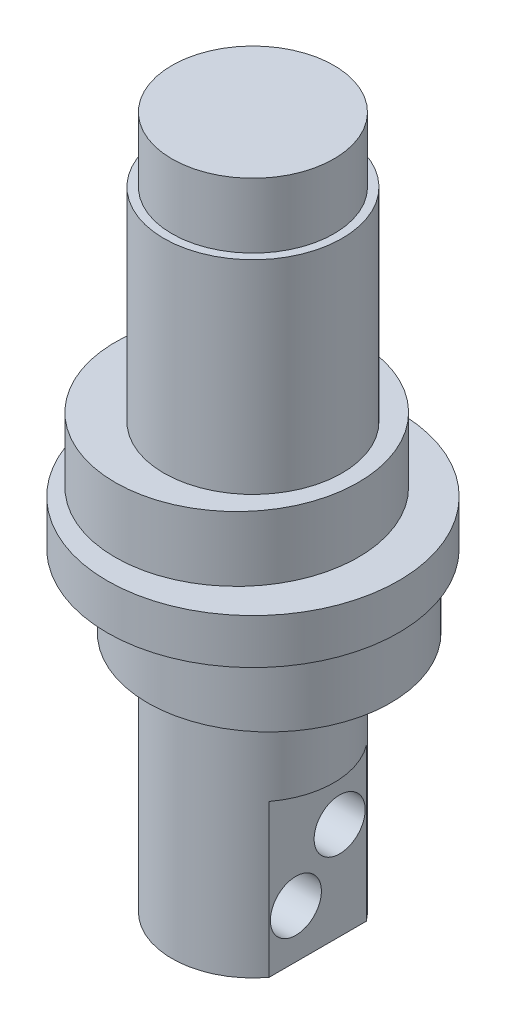
ISO-10303-21;
HEADER;
FILE_DESCRIPTION(('STEP AP214'),'2;1');
FILE_NAME('part.step','',(''),(''),'','','');
FILE_SCHEMA(('AUTOMOTIVE_DESIGN { 1 0 10303 214 1 1 1 1 }'));
ENDSEC;
DATA;
#1=APPLICATION_CONTEXT('core data for automotive mechanical design processes');
#2=APPLICATION_PROTOCOL_DEFINITION('international standard','automotive_design',2000,#1);
#3=PRODUCT_CONTEXT('',#1,'mechanical');
#4=PRODUCT('Part','Part','',(#3));
#5=PRODUCT_RELATED_PRODUCT_CATEGORY('part','',(#4));
#6=PRODUCT_DEFINITION_FORMATION('','',#4);
#7=PRODUCT_DEFINITION_CONTEXT('part definition',#1,'design');
#8=PRODUCT_DEFINITION('design','',#6,#7);
#9=PRODUCT_DEFINITION_SHAPE('','',#8);
#10=(LENGTH_UNIT() NAMED_UNIT(*) SI_UNIT(.MILLI.,.METRE.));
#11=(NAMED_UNIT(*) PLANE_ANGLE_UNIT() SI_UNIT($,.RADIAN.));
#12=(NAMED_UNIT(*) SI_UNIT($,.STERADIAN.) SOLID_ANGLE_UNIT());
#13=UNCERTAINTY_MEASURE_WITH_UNIT(LENGTH_MEASURE(1.E-05),#10,'distance_accuracy_value','');
#14=(GEOMETRIC_REPRESENTATION_CONTEXT(3) GLOBAL_UNCERTAINTY_ASSIGNED_CONTEXT((#13)) GLOBAL_UNIT_ASSIGNED_CONTEXT((#10,
#11,#12)) REPRESENTATION_CONTEXT('',''));
#15=CARTESIAN_POINT('',(0.,0.,0.));
#16=DIRECTION('',(0.,0.,1.));
#17=DIRECTION('',(1.,0.,0.));
#18=AXIS2_PLACEMENT_3D('',#15,#16,#17);
#19=CARTESIAN_POINT('',(1.,2.77916666666667,0.));
#20=DIRECTION('',(0.,-1.,0.));
#21=DIRECTION('',(0.,0.,-1.));
#22=AXIS2_PLACEMENT_3D('',#19,#20,#21);
#23=CYLINDRICAL_SURFACE('',#22,7.5);
#24=CARTESIAN_POINT('',(1.,-4.,0.));
#25=DIRECTION('',(0.,1.,0.));
#26=DIRECTION('',(0.,0.,1.));
#27=AXIS2_PLACEMENT_3D('',#24,#25,#26);
#28=CIRCLE('',#27,7.5);
#29=CARTESIAN_POINT('',(1.,-4.,7.5));
#30=VERTEX_POINT('',#29);
#31=EDGE_CURVE('E166',#30,#30,#28,.T.);
#32=ORIENTED_EDGE('',*,*,#31,.T.);
#33=EDGE_LOOP('',(#32));
#34=FACE_BOUND('',#33,.T.);
#35=CARTESIAN_POINT('',(1.,0.,0.));
#36=DIRECTION('',(0.,1.,0.));
#37=DIRECTION('',(0.,0.,1.));
#38=AXIS2_PLACEMENT_3D('',#35,#36,#37);
#39=CIRCLE('',#38,7.5);
#40=CARTESIAN_POINT('',(1.,0.,7.5));
#41=VERTEX_POINT('',#40);
#42=EDGE_CURVE('E163',#41,#41,#39,.T.);
#43=ORIENTED_EDGE('',*,*,#42,.F.);
#44=EDGE_LOOP('',(#43));
#45=FACE_BOUND('',#44,.T.);
#46=ADVANCED_FACE('F58',(#34,#45),#23,.T.);
#47=CARTESIAN_POINT('',(0.,-10.0166666666667,0.));
#48=DIRECTION('',(0.,-1.,0.));
#49=DIRECTION('',(0.,0.,-1.));
#50=AXIS2_PLACEMENT_3D('',#47,#48,#49);
#51=PLANE('',#50);
#52=CARTESIAN_POINT('',(0.,-10.0166666666667,0.));
#53=DIRECTION('',(0.,-1.,0.));
#54=DIRECTION('',(0.,0.,-1.));
#55=AXIS2_PLACEMENT_3D('',#52,#53,#54);
#56=CIRCLE('',#55,5.);
#57=CARTESIAN_POINT('',(-4.,-10.0166666666667,3.));
#58=VERTEX_POINT('',#57);
#59=CARTESIAN_POINT('',(-4.,-10.0166666666667,-3.));
#60=VERTEX_POINT('',#59);
#61=EDGE_CURVE('E75',#58,#60,#56,.T.);
#62=ORIENTED_EDGE('',*,*,#61,.T.);
#63=DIRECTION('',(0.,0.,1.));
#64=VECTOR('',#63,1.);
#65=CARTESIAN_POINT('',(-4.,-10.0166666666667,0.));
#66=LINE('',#65,#64);
#67=EDGE_CURVE('E79',#60,#58,#66,.T.);
#68=ORIENTED_EDGE('',*,*,#67,.T.);
#69=EDGE_LOOP('',(#62,#68));
#70=FACE_BOUND('',#69,.T.);
#71=ADVANCED_FACE('F223',(#70),#51,.T.);
#72=CARTESIAN_POINT('',(0.,-4.,0.));
#73=DIRECTION('',(0.,1.,0.));
#74=DIRECTION('',(0.,0.,1.));
#75=AXIS2_PLACEMENT_3D('',#72,#73,#74);
#76=PLANE('',#75);
#77=ORIENTED_EDGE('',*,*,#31,.F.);
#78=EDGE_LOOP('',(#77));
#79=FACE_BOUND('',#78,.T.);
#80=CARTESIAN_POINT('',(0.,-4.,0.));
#81=DIRECTION('',(0.,1.,0.));
#82=DIRECTION('',(0.,0.,1.));
#83=AXIS2_PLACEMENT_3D('',#80,#81,#82);
#84=CIRCLE('',#83,5.5);
#85=CARTESIAN_POINT('',(0.,-4.,5.5));
#86=VERTEX_POINT('',#85);
#87=EDGE_CURVE('E12',#86,#86,#84,.F.);
#88=ORIENTED_EDGE('',*,*,#87,.F.);
#89=EDGE_LOOP('',(#88));
#90=FACE_BOUND('',#89,.T.);
#91=ADVANCED_FACE('F231',(#79,#90),#76,.F.);
#92=CARTESIAN_POINT('',(0.,0.,0.));
#93=DIRECTION('',(0.,1.,0.));
#94=DIRECTION('',(0.,0.,1.));
#95=AXIS2_PLACEMENT_3D('',#92,#93,#94);
#96=PLANE('',#95);
#97=ORIENTED_EDGE('',*,*,#42,.T.);
#98=EDGE_LOOP('',(#97));
#99=FACE_BOUND('',#98,.T.);
#100=CARTESIAN_POINT('',(0.,0.,0.));
#101=DIRECTION('',(0.,1.,0.));
#102=DIRECTION('',(0.,0.,1.));
#103=AXIS2_PLACEMENT_3D('',#100,#101,#102);
#104=CIRCLE('',#103,9.);
#105=CARTESIAN_POINT('',(0.,0.,9.));
#106=VERTEX_POINT('',#105);
#107=EDGE_CURVE('E198',#106,#106,#104,.F.);
#108=ORIENTED_EDGE('',*,*,#107,.T.);
#109=EDGE_LOOP('',(#108));
#110=FACE_BOUND('',#109,.T.);
#111=ADVANCED_FACE('F243',(#99,#110),#96,.F.);
#112=CARTESIAN_POINT('',(0.,-5.25416666666667,0.));
#113=DIRECTION('',(0.,-1.,0.));
#114=DIRECTION('',(0.,0.,-1.));
#115=AXIS2_PLACEMENT_3D('',#112,#113,#114);
#116=PLANE('',#115);
#117=CARTESIAN_POINT('',(0.,-5.25416666666667,0.));
#118=DIRECTION('',(0.,-1.,0.));
#119=DIRECTION('',(0.,0.,-1.));
#120=AXIS2_PLACEMENT_3D('',#117,#118,#119);
#121=CIRCLE('',#120,5.5);
#122=CARTESIAN_POINT('',(0.,-5.25416666666667,-5.5));
#123=VERTEX_POINT('',#122);
#124=EDGE_CURVE('E155',#123,#123,#121,.T.);
#125=ORIENTED_EDGE('',*,*,#124,.T.);
#126=EDGE_LOOP('',(#125));
#127=FACE_BOUND('',#126,.T.);
#128=CARTESIAN_POINT('',(0.,-5.25416666666667,0.));
#129=DIRECTION('',(0.,-1.,0.));
#130=DIRECTION('',(0.,0.,-1.));
#131=AXIS2_PLACEMENT_3D('',#128,#129,#130);
#132=CIRCLE('',#131,5.);
#133=CARTESIAN_POINT('',(0.,-5.25416666666667,-5.));
#134=VERTEX_POINT('',#133);
#135=EDGE_CURVE('E152',#134,#134,#132,.T.);
#136=ORIENTED_EDGE('',*,*,#135,.F.);
#137=EDGE_LOOP('',(#136));
#138=FACE_BOUND('',#137,.T.);
#139=ADVANCED_FACE('F244',(#127,#138),#116,.T.);
#140=CARTESIAN_POINT('',(0.,-5.25416666666667,0.));
#141=DIRECTION('',(0.,1.,0.));
#142=DIRECTION('',(0.,0.,1.));
#143=AXIS2_PLACEMENT_3D('',#140,#141,#142);
#144=CYLINDRICAL_SURFACE('',#143,5.5);
#145=ORIENTED_EDGE('',*,*,#124,.F.);
#146=EDGE_LOOP('',(#145));
#147=FACE_BOUND('',#146,.T.);
#148=ORIENTED_EDGE('',*,*,#87,.T.);
#149=EDGE_LOOP('',(#148));
#150=FACE_BOUND('',#149,.T.);
#151=ADVANCED_FACE('F251',(#147,#150),#144,.T.);
#152=DIRECTION('',(0.,0.,1.));
#153=VECTOR('',#152,1.);
#154=CARTESIAN_POINT('',(4.,-10.0166666666667,0.));
#155=LINE('',#154,#153);
#156=CARTESIAN_POINT('',(4.,-10.0166666666667,-3.));
#157=VERTEX_POINT('',#156);
#158=CARTESIAN_POINT('',(4.,-10.0166666666667,3.));
#159=VERTEX_POINT('',#158);
#160=EDGE_CURVE('E191',#157,#159,#155,.T.);
#161=ORIENTED_EDGE('',*,*,#160,.F.);
#162=EDGE_CURVE('E134',#157,#159,#56,.T.);
#163=ORIENTED_EDGE('',*,*,#162,.T.);
#164=EDGE_LOOP('',(#161,#163));
#165=FACE_BOUND('',#164,.T.);
#166=ADVANCED_FACE('F233',(#165),#51,.T.);
#167=CARTESIAN_POINT('',(0.,-10.0166666666667,0.));
#168=DIRECTION('',(0.,1.,0.));
#169=DIRECTION('',(0.,0.,1.));
#170=AXIS2_PLACEMENT_3D('',#167,#168,#169);
#171=CYLINDRICAL_SURFACE('',#170,5.);
#172=ORIENTED_EDGE('',*,*,#135,.T.);
#173=EDGE_LOOP('',(#172));
#174=FACE_BOUND('',#173,.T.);
#175=ORIENTED_EDGE('',*,*,#162,.F.);
#176=DIRECTION('',(0.,1.,0.));
#177=VECTOR('',#176,1.);
#178=CARTESIAN_POINT('',(4.,-19.4166666666667,-3.));
#179=LINE('',#178,#177);
#180=CARTESIAN_POINT('',(4.,-19.4166666666667,-3.));
#181=VERTEX_POINT('',#180);
#182=EDGE_CURVE('E117',#181,#157,#179,.T.);
#183=ORIENTED_EDGE('',*,*,#182,.F.);
#184=CARTESIAN_POINT('',(0.,-19.4166666666667,0.));
#185=DIRECTION('',(0.,-1.,0.));
#186=DIRECTION('',(0.,0.,-1.));
#187=AXIS2_PLACEMENT_3D('',#184,#185,#186);
#188=CIRCLE('',#187,5.);
#189=CARTESIAN_POINT('',(-4.,-19.4166666666667,-3.));
#190=VERTEX_POINT('',#189);
#191=EDGE_CURVE('E123',#190,#181,#188,.T.);
#192=ORIENTED_EDGE('',*,*,#191,.F.);
#193=DIRECTION('',(0.,1.,0.));
#194=VECTOR('',#193,1.);
#195=CARTESIAN_POINT('',(-4.,-19.4166666666667,-3.));
#196=LINE('',#195,#194);
#197=EDGE_CURVE('E202',#190,#60,#196,.T.);
#198=ORIENTED_EDGE('',*,*,#197,.T.);
#199=ORIENTED_EDGE('',*,*,#61,.F.);
#200=DIRECTION('',(0.,1.,0.));
#201=VECTOR('',#200,1.);
#202=CARTESIAN_POINT('',(-4.,-19.4166666666667,3.));
#203=LINE('',#202,#201);
#204=CARTESIAN_POINT('',(-4.,-19.4166666666667,3.));
#205=VERTEX_POINT('',#204);
#206=EDGE_CURVE('E140',#205,#58,#203,.T.);
#207=ORIENTED_EDGE('',*,*,#206,.F.);
#208=CARTESIAN_POINT('',(4.,-19.4166666666667,3.));
#209=VERTEX_POINT('',#208);
#210=EDGE_CURVE('E122',#209,#205,#188,.T.);
#211=ORIENTED_EDGE('',*,*,#210,.F.);
#212=DIRECTION('',(0.,1.,0.));
#213=VECTOR('',#212,1.);
#214=CARTESIAN_POINT('',(4.,-19.4166666666667,3.));
#215=LINE('',#214,#213);
#216=EDGE_CURVE('E119',#209,#159,#215,.T.);
#217=ORIENTED_EDGE('',*,*,#216,.T.);
#218=EDGE_LOOP('',(#175,#183,#192,#198,#199,#207,#211,#217));
#219=FACE_BOUND('',#218,.T.);
#220=ADVANCED_FACE('F133',(#174,#219),#171,.T.);
#221=CARTESIAN_POINT('',(4.,-19.4166666666667,0.));
#222=DIRECTION('',(-1.,0.,0.));
#223=DIRECTION('',(0.,0.,1.));
#224=AXIS2_PLACEMENT_3D('',#221,#222,#223);
#225=PLANE('',#224);
#226=CARTESIAN_POINT('',(4.,-13.4166666666667,-1.35));
#227=DIRECTION('',(-1.,0.,0.));
#228=DIRECTION('',(0.,0.,1.));
#229=AXIS2_PLACEMENT_3D('',#226,#227,#228);
#230=CIRCLE('',#229,1.575);
#231=CARTESIAN_POINT('',(4.,-13.4166666666667,0.225));
#232=VERTEX_POINT('',#231);
#233=EDGE_CURVE('E187',#232,#232,#230,.T.);
#234=ORIENTED_EDGE('',*,*,#233,.T.);
#235=EDGE_LOOP('',(#234));
#236=FACE_BOUND('',#235,.T.);
#237=CARTESIAN_POINT('',(4.,-16.4166666666667,1.35));
#238=DIRECTION('',(-1.,0.,0.));
#239=DIRECTION('',(0.,0.,1.));
#240=AXIS2_PLACEMENT_3D('',#237,#238,#239);
#241=CIRCLE('',#240,1.575);
#242=CARTESIAN_POINT('',(4.,-16.4166666666667,2.925));
#243=VERTEX_POINT('',#242);
#244=EDGE_CURVE('E184',#243,#243,#241,.T.);
#245=ORIENTED_EDGE('',*,*,#244,.T.);
#246=EDGE_LOOP('',(#245));
#247=FACE_BOUND('',#246,.T.);
#248=ORIENTED_EDGE('',*,*,#160,.T.);
#249=ORIENTED_EDGE('',*,*,#216,.F.);
#250=DIRECTION('',(0.,0.,1.));
#251=VECTOR('',#250,1.);
#252=CARTESIAN_POINT('',(4.,-19.4166666666667,0.));
#253=LINE('',#252,#251);
#254=EDGE_CURVE('E112',#181,#209,#253,.T.);
#255=ORIENTED_EDGE('',*,*,#254,.F.);
#256=ORIENTED_EDGE('',*,*,#182,.T.);
#257=EDGE_LOOP('',(#248,#249,#255,#256));
#258=FACE_BOUND('',#257,.T.);
#259=ADVANCED_FACE('F115',(#236,#247,#258),#225,.F.);
#260=CARTESIAN_POINT('',(-4.,-19.4166666666667,0.));
#261=DIRECTION('',(-1.,0.,0.));
#262=DIRECTION('',(0.,0.,1.));
#263=AXIS2_PLACEMENT_3D('',#260,#261,#262);
#264=PLANE('',#263);
#265=CARTESIAN_POINT('',(-4.,-13.4166666666667,-1.35));
#266=DIRECTION('',(-1.,0.,0.));
#267=DIRECTION('',(0.,0.,1.));
#268=AXIS2_PLACEMENT_3D('',#265,#266,#267);
#269=CIRCLE('',#268,1.575);
#270=CARTESIAN_POINT('',(-4.,-13.4166666666667,0.225));
#271=VERTEX_POINT('',#270);
#272=EDGE_CURVE('E185',#271,#271,#269,.T.);
#273=ORIENTED_EDGE('',*,*,#272,.F.);
#274=EDGE_LOOP('',(#273));
#275=FACE_BOUND('',#274,.T.);
#276=CARTESIAN_POINT('',(-4.,-16.4166666666667,1.35));
#277=DIRECTION('',(-1.,0.,0.));
#278=DIRECTION('',(0.,0.,1.));
#279=AXIS2_PLACEMENT_3D('',#276,#277,#278);
#280=CIRCLE('',#279,1.575);
#281=CARTESIAN_POINT('',(-4.,-16.4166666666667,2.925));
#282=VERTEX_POINT('',#281);
#283=EDGE_CURVE('E182',#282,#282,#280,.T.);
#284=ORIENTED_EDGE('',*,*,#283,.F.);
#285=EDGE_LOOP('',(#284));
#286=FACE_BOUND('',#285,.T.);
#287=ORIENTED_EDGE('',*,*,#67,.F.);
#288=ORIENTED_EDGE('',*,*,#197,.F.);
#289=DIRECTION('',(0.,0.,1.));
#290=VECTOR('',#289,1.);
#291=CARTESIAN_POINT('',(-4.,-19.4166666666667,0.));
#292=LINE('',#291,#290);
#293=EDGE_CURVE('E129',#190,#205,#292,.T.);
#294=ORIENTED_EDGE('',*,*,#293,.T.);
#295=ORIENTED_EDGE('',*,*,#206,.T.);
#296=EDGE_LOOP('',(#287,#288,#294,#295));
#297=FACE_BOUND('',#296,.T.);
#298=ADVANCED_FACE('F208',(#275,#286,#297),#264,.T.);
#299=CARTESIAN_POINT('',(0.,-19.4166666666667,0.));
#300=DIRECTION('',(0.,-1.,0.));
#301=DIRECTION('',(0.,0.,-1.));
#302=AXIS2_PLACEMENT_3D('',#299,#300,#301);
#303=PLANE('',#302);
#304=ORIENTED_EDGE('',*,*,#191,.T.);
#305=ORIENTED_EDGE('',*,*,#254,.T.);
#306=ORIENTED_EDGE('',*,*,#210,.T.);
#307=ORIENTED_EDGE('',*,*,#293,.F.);
#308=EDGE_LOOP('',(#304,#305,#306,#307));
#309=FACE_BOUND('',#308,.T.);
#310=ADVANCED_FACE('F127',(#309),#303,.T.);
#311=CARTESIAN_POINT('',(-8.5,-16.4166666666667,1.35));
#312=DIRECTION('',(1.,0.,0.));
#313=DIRECTION('',(0.,0.,-1.));
#314=AXIS2_PLACEMENT_3D('',#311,#312,#313);
#315=CYLINDRICAL_SURFACE('',#314,1.575);
#316=ORIENTED_EDGE('',*,*,#283,.T.);
#317=EDGE_LOOP('',(#316));
#318=FACE_BOUND('',#317,.T.);
#319=ORIENTED_EDGE('',*,*,#244,.F.);
#320=EDGE_LOOP('',(#319));
#321=FACE_BOUND('',#320,.T.);
#322=ADVANCED_FACE('F217',(#318,#321),#315,.F.);
#323=CARTESIAN_POINT('',(-8.5,-13.4166666666667,-1.35));
#324=DIRECTION('',(1.,0.,0.));
#325=DIRECTION('',(0.,0.,-1.));
#326=AXIS2_PLACEMENT_3D('',#323,#324,#325);
#327=CYLINDRICAL_SURFACE('',#326,1.575);
#328=ORIENTED_EDGE('',*,*,#272,.T.);
#329=EDGE_LOOP('',(#328));
#330=FACE_BOUND('',#329,.T.);
#331=ORIENTED_EDGE('',*,*,#233,.F.);
#332=EDGE_LOOP('',(#331));
#333=FACE_BOUND('',#332,.T.);
#334=ADVANCED_FACE('F339',(#330,#333),#327,.F.);
#335=CARTESIAN_POINT('',(0.,-25.4558441227157,0.));
#336=DIRECTION('',(0.,1.,0.));
#337=DIRECTION('',(0.,0.,1.));
#338=AXIS2_PLACEMENT_3D('',#335,#336,#337);
#339=CYLINDRICAL_SURFACE('',#338,9.);
#340=ORIENTED_EDGE('',*,*,#107,.F.);
#341=EDGE_LOOP('',(#340));
#342=FACE_BOUND('',#341,.T.);
#343=CARTESIAN_POINT('',(0.,2.77916666666667,0.));
#344=DIRECTION('',(0.,1.,0.));
#345=DIRECTION('',(0.,0.,1.));
#346=AXIS2_PLACEMENT_3D('',#343,#344,#345);
#347=CIRCLE('',#346,9.);
#348=CARTESIAN_POINT('',(0.,2.77916666666667,9.));
#349=VERTEX_POINT('',#348);
#350=EDGE_CURVE('E332',#349,#349,#347,.T.);
#351=ORIENTED_EDGE('',*,*,#350,.F.);
#352=EDGE_LOOP('',(#351));
#353=FACE_BOUND('',#352,.T.);
#354=ADVANCED_FACE('F338',(#342,#353),#339,.T.);
#355=CARTESIAN_POINT('',(0.,2.77916666666667,0.));
#356=DIRECTION('',(0.,1.,0.));
#357=DIRECTION('',(0.,0.,1.));
#358=AXIS2_PLACEMENT_3D('',#355,#356,#357);
#359=PLANE('',#358);
#360=CARTESIAN_POINT('',(-1.,2.77916666666667,0.));
#361=DIRECTION('',(0.,1.,0.));
#362=DIRECTION('',(0.,0.,1.));
#363=AXIS2_PLACEMENT_3D('',#360,#361,#362);
#364=CIRCLE('',#363,7.5);
#365=CARTESIAN_POINT('',(-1.,2.77916666666667,7.5));
#366=VERTEX_POINT('',#365);
#367=EDGE_CURVE('E62',#366,#366,#364,.T.);
#368=ORIENTED_EDGE('',*,*,#367,.F.);
#369=EDGE_LOOP('',(#368));
#370=FACE_BOUND('',#369,.T.);
#371=ORIENTED_EDGE('',*,*,#350,.T.);
#372=EDGE_LOOP('',(#371));
#373=FACE_BOUND('',#372,.T.);
#374=ADVANCED_FACE('F306',(#370,#373),#359,.T.);
#375=CARTESIAN_POINT('',(0.,23.3208333333333,0.));
#376=DIRECTION('',(0.,1.,0.));
#377=DIRECTION('',(0.,0.,1.));
#378=AXIS2_PLACEMENT_3D('',#375,#376,#377);
#379=PLANE('',#378);
#380=CARTESIAN_POINT('',(0.,23.3208333333333,0.));
#381=DIRECTION('',(0.,1.,0.));
#382=DIRECTION('',(0.,0.,1.));
#383=AXIS2_PLACEMENT_3D('',#380,#381,#382);
#384=CIRCLE('',#383,5.);
#385=CARTESIAN_POINT('',(0.,23.3208333333333,5.));
#386=VERTEX_POINT('',#385);
#387=EDGE_CURVE('E148',#386,#386,#384,.T.);
#388=ORIENTED_EDGE('',*,*,#387,.T.);
#389=EDGE_LOOP('',(#388));
#390=FACE_BOUND('',#389,.T.);
#391=ADVANCED_FACE('F303',(#390),#379,.T.);
#392=CARTESIAN_POINT('',(0.,23.3208333333333,0.));
#393=DIRECTION('',(0.,-1.,0.));
#394=DIRECTION('',(0.,0.,-1.));
#395=AXIS2_PLACEMENT_3D('',#392,#393,#394);
#396=CYLINDRICAL_SURFACE('',#395,5.);
#397=CARTESIAN_POINT('',(0.,19.3208333333333,0.));
#398=DIRECTION('',(0.,1.,0.));
#399=DIRECTION('',(0.,0.,1.));
#400=AXIS2_PLACEMENT_3D('',#397,#398,#399);
#401=CIRCLE('',#400,5.);
#402=CARTESIAN_POINT('',(0.,19.3208333333333,5.));
#403=VERTEX_POINT('',#402);
#404=EDGE_CURVE('E138',#403,#403,#401,.T.);
#405=ORIENTED_EDGE('',*,*,#404,.T.);
#406=EDGE_LOOP('',(#405));
#407=FACE_BOUND('',#406,.T.);
#408=ORIENTED_EDGE('',*,*,#387,.F.);
#409=EDGE_LOOP('',(#408));
#410=FACE_BOUND('',#409,.T.);
#411=ADVANCED_FACE('F299',(#407,#410),#396,.T.);
#412=CARTESIAN_POINT('',(0.,19.3208333333333,0.));
#413=DIRECTION('',(0.,1.,0.));
#414=DIRECTION('',(0.,0.,1.));
#415=AXIS2_PLACEMENT_3D('',#412,#413,#414);
#416=PLANE('',#415);
#417=ORIENTED_EDGE('',*,*,#404,.F.);
#418=EDGE_LOOP('',(#417));
#419=FACE_BOUND('',#418,.T.);
#420=CARTESIAN_POINT('',(0.,19.3208333333333,0.));
#421=DIRECTION('',(0.,1.,0.));
#422=DIRECTION('',(0.,0.,1.));
#423=AXIS2_PLACEMENT_3D('',#420,#421,#422);
#424=CIRCLE('',#423,5.5);
#425=CARTESIAN_POINT('',(0.,19.3208333333333,5.5));
#426=VERTEX_POINT('',#425);
#427=EDGE_CURVE('E146',#426,#426,#424,.T.);
#428=ORIENTED_EDGE('',*,*,#427,.T.);
#429=EDGE_LOOP('',(#428));
#430=FACE_BOUND('',#429,.T.);
#431=ADVANCED_FACE('F302',(#419,#430),#416,.T.);
#432=CARTESIAN_POINT('',(0.,19.3208333333333,0.));
#433=DIRECTION('',(0.,-1.,0.));
#434=DIRECTION('',(0.,0.,-1.));
#435=AXIS2_PLACEMENT_3D('',#432,#433,#434);
#436=CYLINDRICAL_SURFACE('',#435,5.5);
#437=ORIENTED_EDGE('',*,*,#427,.F.);
#438=EDGE_LOOP('',(#437));
#439=FACE_BOUND('',#438,.T.);
#440=CARTESIAN_POINT('',(0.,6.77916666666667,0.));
#441=DIRECTION('',(0.,1.,0.));
#442=DIRECTION('',(0.,0.,1.));
#443=AXIS2_PLACEMENT_3D('',#440,#441,#442);
#444=CIRCLE('',#443,5.5);
#445=CARTESIAN_POINT('',(0.,6.77916666666667,5.5));
#446=VERTEX_POINT('',#445);
#447=EDGE_CURVE('E135',#446,#446,#444,.T.);
#448=ORIENTED_EDGE('',*,*,#447,.T.);
#449=EDGE_LOOP('',(#448));
#450=FACE_BOUND('',#449,.T.);
#451=ADVANCED_FACE('F241',(#439,#450),#436,.T.);
#452=CARTESIAN_POINT('',(0.,6.77916666666667,0.));
#453=DIRECTION('',(0.,1.,0.));
#454=DIRECTION('',(0.,0.,1.));
#455=AXIS2_PLACEMENT_3D('',#452,#453,#454);
#456=PLANE('',#455);
#457=ORIENTED_EDGE('',*,*,#447,.F.);
#458=EDGE_LOOP('',(#457));
#459=FACE_BOUND('',#458,.T.);
#460=CARTESIAN_POINT('',(-1.,6.77916666666667,0.));
#461=DIRECTION('',(0.,1.,0.));
#462=DIRECTION('',(0.,0.,1.));
#463=AXIS2_PLACEMENT_3D('',#460,#461,#462);
#464=CIRCLE('',#463,7.5);
#465=CARTESIAN_POINT('',(-1.,6.77916666666667,7.5));
#466=VERTEX_POINT('',#465);
#467=EDGE_CURVE('E68',#466,#466,#464,.T.);
#468=ORIENTED_EDGE('',*,*,#467,.T.);
#469=EDGE_LOOP('',(#468));
#470=FACE_BOUND('',#469,.T.);
#471=ADVANCED_FACE('F239',(#459,#470),#456,.T.);
#472=CARTESIAN_POINT('',(-1.,6.77916666666667,0.));
#473=DIRECTION('',(0.,-1.,0.));
#474=DIRECTION('',(0.,0.,-1.));
#475=AXIS2_PLACEMENT_3D('',#472,#473,#474);
#476=CYLINDRICAL_SURFACE('',#475,7.5);
#477=ORIENTED_EDGE('',*,*,#367,.T.);
#478=EDGE_LOOP('',(#477));
#479=FACE_BOUND('',#478,.T.);
#480=ORIENTED_EDGE('',*,*,#467,.F.);
#481=EDGE_LOOP('',(#480));
#482=FACE_BOUND('',#481,.T.);
#483=ADVANCED_FACE('F60',(#479,#482),#476,.T.);
#484=CLOSED_SHELL('',(#46,#71,#91,#111,#139,#151,#166,#220,#259,#298,#310,#322,#334,#354,#374,
#391,#411,#431,#451,#471,#483));
#485=CARTESIAN_POINT('',(0.,0.,0.));
#486=DIRECTION('',(0.,1.,0.));
#487=DIRECTION('',(0.,0.,1.));
#488=AXIS2_PLACEMENT_3D('',#485,#486,#487);
#489=CIRCLE('',#488,2.627);
#490=CARTESIAN_POINT('',(-1.54175224987674,0.,-2.127));
#491=VERTEX_POINT('',#490);
#492=CARTESIAN_POINT('',(1.54175224987674,0.,-2.127));
#493=VERTEX_POINT('',#492);
#494=EDGE_CURVE('E159',#491,#493,#489,.T.);
#495=ORIENTED_EDGE('',*,*,#494,.F.);
#496=DIRECTION('',(1.,0.,0.));
#497=VECTOR('',#496,1.);
#498=CARTESIAN_POINT('',(0.,0.,-2.127));
#499=LINE('',#498,#497);
#500=EDGE_CURVE('E171',#491,#493,#499,.T.);
#501=ORIENTED_EDGE('',*,*,#500,.T.);
#502=EDGE_LOOP('',(#495,#501));
#503=FACE_BOUND('',#502,.T.);
#504=ADVANCED_FACE('F246',(#503),#96,.F.);
#505=CARTESIAN_POINT('',(0.,-4.,-2.127));
#506=DIRECTION('',(0.,0.,1.));
#507=DIRECTION('',(1.,0.,0.));
#508=AXIS2_PLACEMENT_3D('',#505,#506,#507);
#509=PLANE('',#508);
#510=ORIENTED_EDGE('',*,*,#500,.F.);
#511=DIRECTION('',(0.,1.,0.));
#512=VECTOR('',#511,1.);
#513=CARTESIAN_POINT('',(-1.54175224987674,-4.,-2.127));
#514=LINE('',#513,#512);
#515=CARTESIAN_POINT('',(-1.54175224987674,-4.,-2.127));
#516=VERTEX_POINT('',#515);
#517=EDGE_CURVE('E169',#516,#491,#514,.T.);
#518=ORIENTED_EDGE('',*,*,#517,.F.);
#519=DIRECTION('',(1.,0.,0.));
#520=VECTOR('',#519,1.);
#521=CARTESIAN_POINT('',(0.,-4.,-2.127));
#522=LINE('',#521,#520);
#523=CARTESIAN_POINT('',(1.54175224987674,-4.,-2.127));
#524=VERTEX_POINT('',#523);
#525=EDGE_CURVE('E162',#516,#524,#522,.T.);
#526=ORIENTED_EDGE('',*,*,#525,.T.);
#527=DIRECTION('',(0.,1.,0.));
#528=VECTOR('',#527,1.);
#529=CARTESIAN_POINT('',(1.54175224987674,-4.,-2.127));
#530=LINE('',#529,#528);
#531=EDGE_CURVE('E176',#524,#493,#530,.T.);
#532=ORIENTED_EDGE('',*,*,#531,.T.);
#533=EDGE_LOOP('',(#510,#518,#526,#532));
#534=FACE_BOUND('',#533,.T.);
#535=ADVANCED_FACE('F259',(#534),#509,.T.);
#536=CARTESIAN_POINT('',(0.,-4.,0.));
#537=DIRECTION('',(0.,1.,0.));
#538=DIRECTION('',(0.,0.,1.));
#539=AXIS2_PLACEMENT_3D('',#536,#537,#538);
#540=CYLINDRICAL_SURFACE('',#539,2.627);
#541=ORIENTED_EDGE('',*,*,#494,.T.);
#542=ORIENTED_EDGE('',*,*,#531,.F.);
#543=CARTESIAN_POINT('',(0.,-4.,0.));
#544=DIRECTION('',(0.,1.,0.));
#545=DIRECTION('',(0.,0.,1.));
#546=AXIS2_PLACEMENT_3D('',#543,#544,#545);
#547=CIRCLE('',#546,2.627);
#548=EDGE_CURVE('E160',#516,#524,#547,.T.);
#549=ORIENTED_EDGE('',*,*,#548,.F.);
#550=ORIENTED_EDGE('',*,*,#517,.T.);
#551=EDGE_LOOP('',(#541,#542,#549,#550));
#552=FACE_BOUND('',#551,.T.);
#553=ADVANCED_FACE('F237',(#552),#540,.F.);
#554=CARTESIAN_POINT('',(0.,-4.,0.));
#555=DIRECTION('',(0.,-1.,0.));
#556=DIRECTION('',(0.,0.,-1.));
#557=AXIS2_PLACEMENT_3D('',#554,#555,#556);
#558=PLANE('',#557);
#559=ORIENTED_EDGE('',*,*,#525,.F.);
#560=ORIENTED_EDGE('',*,*,#548,.T.);
#561=EDGE_LOOP('',(#559,#560));
#562=FACE_BOUND('',#561,.T.);
#563=ADVANCED_FACE('F273',(#562),#558,.F.);
#564=CLOSED_SHELL('',(#504,#535,#553,#563));
#565=ORIENTED_CLOSED_SHELL('',*,#564,.T.);
#566=BREP_WITH_VOIDS('B2',#484,(#565));
#567=ADVANCED_BREP_SHAPE_REPRESENTATION('',(#18,#566),#14);
#568=SHAPE_DEFINITION_REPRESENTATION(#9,#567);
ENDSEC;
END-ISO-10303-21;
